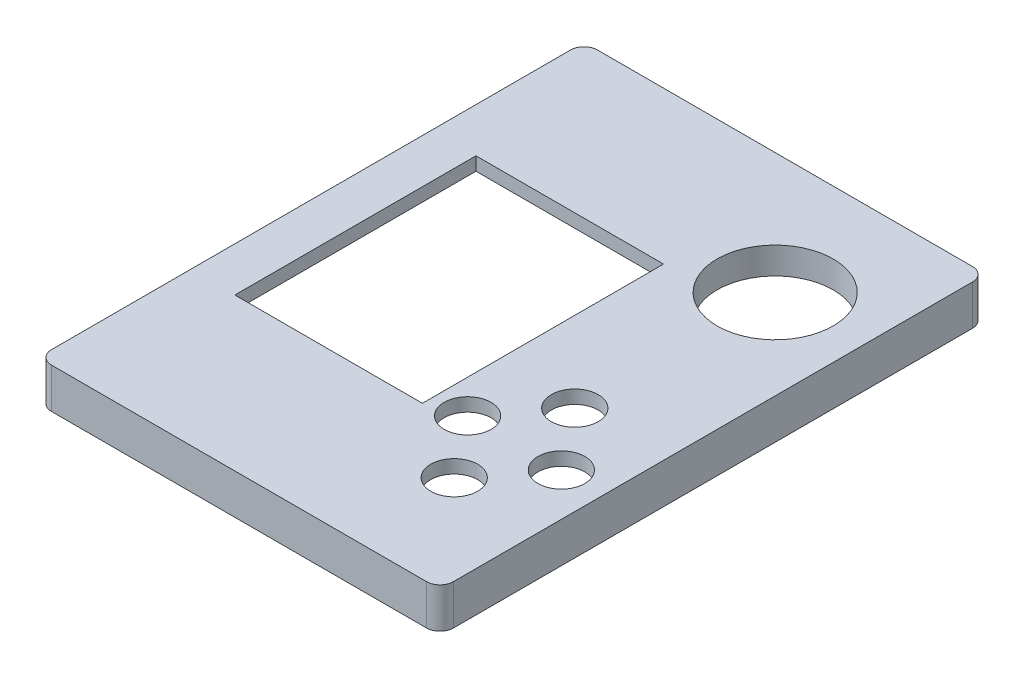
ISO-10303-21;
HEADER;
FILE_DESCRIPTION(('STEP AP214'),'2;1');
FILE_NAME('part.step','',(''),(''),'','','');
FILE_SCHEMA(('AUTOMOTIVE_DESIGN { 1 0 10303 214 1 1 1 1 }'));
ENDSEC;
DATA;
#1=APPLICATION_CONTEXT('core data for automotive mechanical design processes');
#2=APPLICATION_PROTOCOL_DEFINITION('international standard','automotive_design',2000,#1);
#3=PRODUCT_CONTEXT('',#1,'mechanical');
#4=PRODUCT('Part','Part','',(#3));
#5=PRODUCT_RELATED_PRODUCT_CATEGORY('part','',(#4));
#6=PRODUCT_DEFINITION_FORMATION('','',#4);
#7=PRODUCT_DEFINITION_CONTEXT('part definition',#1,'design');
#8=PRODUCT_DEFINITION('design','',#6,#7);
#9=PRODUCT_DEFINITION_SHAPE('','',#8);
#10=(LENGTH_UNIT() NAMED_UNIT(*) SI_UNIT(.MILLI.,.METRE.));
#11=(NAMED_UNIT(*) PLANE_ANGLE_UNIT() SI_UNIT($,.RADIAN.));
#12=(NAMED_UNIT(*) SI_UNIT($,.STERADIAN.) SOLID_ANGLE_UNIT());
#13=UNCERTAINTY_MEASURE_WITH_UNIT(LENGTH_MEASURE(1.E-05),#10,'distance_accuracy_value','');
#14=(GEOMETRIC_REPRESENTATION_CONTEXT(3) GLOBAL_UNCERTAINTY_ASSIGNED_CONTEXT((#13)) GLOBAL_UNIT_ASSIGNED_CONTEXT((#10,
#11,#12)) REPRESENTATION_CONTEXT('',''));
#15=CARTESIAN_POINT('',(0.,0.,0.));
#16=DIRECTION('',(0.,0.,1.));
#17=DIRECTION('',(1.,0.,0.));
#18=AXIS2_PLACEMENT_3D('',#15,#16,#17);
#19=CARTESIAN_POINT('',(-35.959,9.,37.875));
#20=DIRECTION('',(0.,-1.,0.));
#21=DIRECTION('',(0.,0.,-1.));
#22=AXIS2_PLACEMENT_3D('',#19,#20,#21);
#23=CYLINDRICAL_SURFACE('',#22,1.45);
#24=CARTESIAN_POINT('',(-35.959,0.,37.875));
#25=DIRECTION('',(0.,-1.,0.));
#26=DIRECTION('',(0.,0.,-1.));
#27=AXIS2_PLACEMENT_3D('',#24,#25,#26);
#28=CIRCLE('',#27,1.45);
#29=CARTESIAN_POINT('',(-35.959,0.,36.425));
#30=VERTEX_POINT('',#29);
#31=EDGE_CURVE('E286',#30,#30,#28,.T.);
#32=ORIENTED_EDGE('',*,*,#31,.T.);
#33=EDGE_LOOP('',(#32));
#34=FACE_BOUND('',#33,.T.);
#35=CARTESIAN_POINT('',(-35.959,7.,37.875));
#36=DIRECTION('',(0.,1.,0.));
#37=DIRECTION('',(0.,0.,1.));
#38=AXIS2_PLACEMENT_3D('',#35,#36,#37);
#39=CIRCLE('',#38,1.45);
#40=CARTESIAN_POINT('',(-35.959,7.,39.325));
#41=VERTEX_POINT('',#40);
#42=EDGE_CURVE('E12',#41,#41,#39,.F.);
#43=ORIENTED_EDGE('',*,*,#42,.F.);
#44=EDGE_LOOP('',(#43));
#45=FACE_BOUND('',#44,.T.);
#46=ADVANCED_FACE('F44',(#34,#45),#23,.F.);
#47=CARTESIAN_POINT('',(-35.959,9.,-52.125));
#48=DIRECTION('',(0.,-1.,0.));
#49=DIRECTION('',(0.,0.,-1.));
#50=AXIS2_PLACEMENT_3D('',#47,#48,#49);
#51=CYLINDRICAL_SURFACE('',#50,1.45);
#52=CARTESIAN_POINT('',(-35.959,0.,-52.125));
#53=DIRECTION('',(0.,-1.,0.));
#54=DIRECTION('',(0.,0.,-1.));
#55=AXIS2_PLACEMENT_3D('',#52,#53,#54);
#56=CIRCLE('',#55,1.45);
#57=CARTESIAN_POINT('',(-35.959,0.,-53.5749999999999));
#58=VERTEX_POINT('',#57);
#59=EDGE_CURVE('E287',#58,#58,#56,.T.);
#60=ORIENTED_EDGE('',*,*,#59,.T.);
#61=EDGE_LOOP('',(#60));
#62=FACE_BOUND('',#61,.T.);
#63=CARTESIAN_POINT('',(-35.959,7.,-52.125));
#64=DIRECTION('',(0.,1.,0.));
#65=DIRECTION('',(0.,0.,1.));
#66=AXIS2_PLACEMENT_3D('',#63,#64,#65);
#67=CIRCLE('',#66,1.45);
#68=CARTESIAN_POINT('',(-35.959,7.,-50.6749999999999));
#69=VERTEX_POINT('',#68);
#70=EDGE_CURVE('E52',#69,#69,#67,.F.);
#71=ORIENTED_EDGE('',*,*,#70,.F.);
#72=EDGE_LOOP('',(#71));
#73=FACE_BOUND('',#72,.T.);
#74=ADVANCED_FACE('F354',(#62,#73),#51,.F.);
#75=CARTESIAN_POINT('',(35.959,9.,37.875));
#76=DIRECTION('',(0.,-1.,0.));
#77=DIRECTION('',(0.,0.,-1.));
#78=AXIS2_PLACEMENT_3D('',#75,#76,#77);
#79=CYLINDRICAL_SURFACE('',#78,1.45);
#80=CARTESIAN_POINT('',(35.959,0.,37.875));
#81=DIRECTION('',(0.,1.,0.));
#82=DIRECTION('',(0.,0.,-1.));
#83=AXIS2_PLACEMENT_3D('',#80,#81,#82);
#84=CIRCLE('',#83,1.45);
#85=CARTESIAN_POINT('',(35.959,0.,36.425));
#86=VERTEX_POINT('',#85);
#87=EDGE_CURVE('E228',#86,#86,#84,.T.);
#88=ORIENTED_EDGE('',*,*,#87,.F.);
#89=EDGE_LOOP('',(#88));
#90=FACE_BOUND('',#89,.T.);
#91=CARTESIAN_POINT('',(35.959,7.,37.875));
#92=DIRECTION('',(0.,1.,0.));
#93=DIRECTION('',(0.,0.,1.));
#94=AXIS2_PLACEMENT_3D('',#91,#92,#93);
#95=CIRCLE('',#94,1.45);
#96=CARTESIAN_POINT('',(35.959,7.,39.325));
#97=VERTEX_POINT('',#96);
#98=EDGE_CURVE('E545',#97,#97,#95,.T.);
#99=ORIENTED_EDGE('',*,*,#98,.T.);
#100=EDGE_LOOP('',(#99));
#101=FACE_BOUND('',#100,.T.);
#102=ADVANCED_FACE('F356',(#90,#101),#79,.F.);
#103=CARTESIAN_POINT('',(35.959,9.,-52.125));
#104=DIRECTION('',(0.,-1.,0.));
#105=DIRECTION('',(0.,0.,-1.));
#106=AXIS2_PLACEMENT_3D('',#103,#104,#105);
#107=CYLINDRICAL_SURFACE('',#106,1.45);
#108=CARTESIAN_POINT('',(35.959,0.,-52.125));
#109=DIRECTION('',(0.,1.,0.));
#110=DIRECTION('',(0.,0.,-1.));
#111=AXIS2_PLACEMENT_3D('',#108,#109,#110);
#112=CIRCLE('',#111,1.45);
#113=CARTESIAN_POINT('',(35.959,0.,-53.5749999999999));
#114=VERTEX_POINT('',#113);
#115=EDGE_CURVE('E278',#114,#114,#112,.T.);
#116=ORIENTED_EDGE('',*,*,#115,.F.);
#117=EDGE_LOOP('',(#116));
#118=FACE_BOUND('',#117,.T.);
#119=CARTESIAN_POINT('',(35.959,7.,-52.125));
#120=DIRECTION('',(0.,1.,0.));
#121=DIRECTION('',(0.,0.,1.));
#122=AXIS2_PLACEMENT_3D('',#119,#120,#121);
#123=CIRCLE('',#122,1.45);
#124=CARTESIAN_POINT('',(35.959,7.,-50.6749999999999));
#125=VERTEX_POINT('',#124);
#126=EDGE_CURVE('E543',#125,#125,#123,.T.);
#127=ORIENTED_EDGE('',*,*,#126,.T.);
#128=EDGE_LOOP('',(#127));
#129=FACE_BOUND('',#128,.T.);
#130=ADVANCED_FACE('F363',(#118,#129),#107,.F.);
#131=CARTESIAN_POINT('',(24.9344177008975,-0.000999999999999265,-34.));
#132=DIRECTION('',(0.,1.,0.));
#133=DIRECTION('',(0.,0.,1.));
#134=AXIS2_PLACEMENT_3D('',#131,#132,#133);
#135=CYLINDRICAL_SURFACE('',#134,13.);
#136=CARTESIAN_POINT('',(24.9344177008975,9.,-34.));
#137=DIRECTION('',(0.,1.,0.));
#138=DIRECTION('',(0.,0.,1.));
#139=AXIS2_PLACEMENT_3D('',#136,#137,#138);
#140=CIRCLE('',#139,13.);
#141=CARTESIAN_POINT('',(24.9344177008975,9.,-21.));
#142=VERTEX_POINT('',#141);
#143=EDGE_CURVE('E281',#142,#142,#140,.T.);
#144=ORIENTED_EDGE('',*,*,#143,.T.);
#145=EDGE_LOOP('',(#144));
#146=FACE_BOUND('',#145,.T.);
#147=CARTESIAN_POINT('',(24.9344177008975,3.,-34.));
#148=DIRECTION('',(0.,-1.,0.));
#149=DIRECTION('',(0.,0.,-1.));
#150=AXIS2_PLACEMENT_3D('',#147,#148,#149);
#151=CIRCLE('',#150,13.);
#152=CARTESIAN_POINT('',(24.9344177008975,3.,-47.));
#153=VERTEX_POINT('',#152);
#154=EDGE_CURVE('E213',#153,#153,#151,.F.);
#155=ORIENTED_EDGE('',*,*,#154,.F.);
#156=EDGE_LOOP('',(#155));
#157=FACE_BOUND('',#156,.T.);
#158=ADVANCED_FACE('F369',(#146,#157),#135,.F.);
#159=CARTESIAN_POINT('',(24.9344177008975,-0.000999999999999265,-34.));
#160=DIRECTION('',(0.,1.,0.));
#161=DIRECTION('',(0.,0.,1.));
#162=AXIS2_PLACEMENT_3D('',#159,#160,#161);
#163=CYLINDRICAL_SURFACE('',#162,16.);
#164=CARTESIAN_POINT('',(24.9344177008975,6.,-34.));
#165=DIRECTION('',(0.,1.,0.));
#166=DIRECTION('',(0.,0.,1.));
#167=AXIS2_PLACEMENT_3D('',#164,#165,#166);
#168=CIRCLE('',#167,16.);
#169=CARTESIAN_POINT('',(24.9344177008975,6.,-18.));
#170=VERTEX_POINT('',#169);
#171=EDGE_CURVE('E244',#170,#170,#168,.T.);
#172=ORIENTED_EDGE('',*,*,#171,.F.);
#173=EDGE_LOOP('',(#172));
#174=FACE_BOUND('',#173,.T.);
#175=CARTESIAN_POINT('',(24.9344177008975,3.,-34.));
#176=DIRECTION('',(0.,-1.,0.));
#177=DIRECTION('',(0.,0.,-1.));
#178=AXIS2_PLACEMENT_3D('',#175,#176,#177);
#179=CIRCLE('',#178,16.);
#180=CARTESIAN_POINT('',(24.9344177008975,3.,-50.));
#181=VERTEX_POINT('',#180);
#182=EDGE_CURVE('E208',#181,#181,#179,.T.);
#183=ORIENTED_EDGE('',*,*,#182,.F.);
#184=EDGE_LOOP('',(#183));
#185=FACE_BOUND('',#184,.T.);
#186=ADVANCED_FACE('F523',(#174,#185),#163,.T.);
#187=CARTESIAN_POINT('',(42.,0.,58.125));
#188=DIRECTION('',(0.,1.,0.));
#189=DIRECTION('',(0.,0.,1.));
#190=AXIS2_PLACEMENT_3D('',#187,#188,#189);
#191=PLANE('',#190);
#192=ORIENTED_EDGE('',*,*,#115,.T.);
#193=EDGE_LOOP('',(#192));
#194=FACE_BOUND('',#193,.T.);
#195=CARTESIAN_POINT('',(35.959,0.,-52.125));
#196=DIRECTION('',(0.,1.,0.));
#197=DIRECTION('',(0.,0.,1.));
#198=AXIS2_PLACEMENT_3D('',#195,#196,#197);
#199=CIRCLE('',#198,4.45);
#200=CARTESIAN_POINT('',(35.959,0.,-47.6749999999999));
#201=VERTEX_POINT('',#200);
#202=EDGE_CURVE('E245',#201,#201,#199,.T.);
#203=ORIENTED_EDGE('',*,*,#202,.F.);
#204=EDGE_LOOP('',(#203));
#205=FACE_BOUND('',#204,.T.);
#206=ADVANCED_FACE('F381',(#194,#205),#191,.F.);
#207=ORIENTED_EDGE('',*,*,#87,.T.);
#208=EDGE_LOOP('',(#207));
#209=FACE_BOUND('',#208,.T.);
#210=CARTESIAN_POINT('',(35.959,0.,37.875));
#211=DIRECTION('',(0.,1.,0.));
#212=DIRECTION('',(0.,0.,1.));
#213=AXIS2_PLACEMENT_3D('',#210,#211,#212);
#214=CIRCLE('',#213,4.45);
#215=CARTESIAN_POINT('',(35.959,0.,42.3250000000001));
#216=VERTEX_POINT('',#215);
#217=EDGE_CURVE('E216',#216,#216,#214,.T.);
#218=ORIENTED_EDGE('',*,*,#217,.F.);
#219=EDGE_LOOP('',(#218));
#220=FACE_BOUND('',#219,.T.);
#221=ADVANCED_FACE('F444',(#209,#220),#191,.F.);
#222=CARTESIAN_POINT('',(-35.959,0.,-52.125));
#223=DIRECTION('',(0.,1.,0.));
#224=DIRECTION('',(0.,0.,1.));
#225=AXIS2_PLACEMENT_3D('',#222,#223,#224);
#226=CIRCLE('',#225,4.45);
#227=CARTESIAN_POINT('',(-35.959,0.,-47.6749999999999));
#228=VERTEX_POINT('',#227);
#229=EDGE_CURVE('E256',#228,#228,#226,.F.);
#230=ORIENTED_EDGE('',*,*,#229,.T.);
#231=EDGE_LOOP('',(#230));
#232=FACE_BOUND('',#231,.T.);
#233=ORIENTED_EDGE('',*,*,#59,.F.);
#234=EDGE_LOOP('',(#233));
#235=FACE_BOUND('',#234,.T.);
#236=ADVANCED_FACE('F439',(#232,#235),#191,.F.);
#237=CARTESIAN_POINT('',(-35.959,0.,37.875));
#238=DIRECTION('',(0.,1.,0.));
#239=DIRECTION('',(0.,0.,1.));
#240=AXIS2_PLACEMENT_3D('',#237,#238,#239);
#241=CIRCLE('',#240,4.45);
#242=CARTESIAN_POINT('',(-35.959,0.,42.3250000000001));
#243=VERTEX_POINT('',#242);
#244=EDGE_CURVE('E259',#243,#243,#241,.F.);
#245=ORIENTED_EDGE('',*,*,#244,.T.);
#246=EDGE_LOOP('',(#245));
#247=FACE_BOUND('',#246,.T.);
#248=ORIENTED_EDGE('',*,*,#31,.F.);
#249=EDGE_LOOP('',(#248));
#250=FACE_BOUND('',#249,.T.);
#251=ADVANCED_FACE('F382',(#247,#250),#191,.F.);
#252=CARTESIAN_POINT('',(42.,9.,58.125));
#253=DIRECTION('',(0.,-1.,0.));
#254=DIRECTION('',(0.,0.,-1.));
#255=AXIS2_PLACEMENT_3D('',#252,#253,#254);
#256=CYLINDRICAL_SURFACE('',#255,3.00000000000001);
#257=CARTESIAN_POINT('',(42.,0.,58.125));
#258=DIRECTION('',(0.,1.,0.));
#259=DIRECTION('',(0.,0.,1.));
#260=AXIS2_PLACEMENT_3D('',#257,#258,#259);
#261=CIRCLE('',#260,3.00000000000001);
#262=CARTESIAN_POINT('',(42.,0.,61.125));
#263=VERTEX_POINT('',#262);
#264=CARTESIAN_POINT('',(45.,0.,58.125));
#265=VERTEX_POINT('',#264);
#266=EDGE_CURVE('E290',#263,#265,#261,.T.);
#267=ORIENTED_EDGE('',*,*,#266,.T.);
#268=DIRECTION('',(0.,-1.,0.));
#269=VECTOR('',#268,1.);
#270=CARTESIAN_POINT('',(45.,9.,58.125));
#271=LINE('',#270,#269);
#272=CARTESIAN_POINT('',(45.,9.,58.125));
#273=VERTEX_POINT('',#272);
#274=EDGE_CURVE('E347',#273,#265,#271,.T.);
#275=ORIENTED_EDGE('',*,*,#274,.F.);
#276=CARTESIAN_POINT('',(42.,9.,58.125));
#277=DIRECTION('',(0.,1.,0.));
#278=DIRECTION('',(0.,0.,1.));
#279=AXIS2_PLACEMENT_3D('',#276,#277,#278);
#280=CIRCLE('',#279,3.00000000000001);
#281=CARTESIAN_POINT('',(42.,9.,61.125));
#282=VERTEX_POINT('',#281);
#283=EDGE_CURVE('E293',#282,#273,#280,.T.);
#284=ORIENTED_EDGE('',*,*,#283,.F.);
#285=DIRECTION('',(0.,-1.,0.));
#286=VECTOR('',#285,1.);
#287=CARTESIAN_POINT('',(42.,9.,61.125));
#288=LINE('',#287,#286);
#289=EDGE_CURVE('E311',#282,#263,#288,.T.);
#290=ORIENTED_EDGE('',*,*,#289,.T.);
#291=EDGE_LOOP('',(#267,#275,#284,#290));
#292=FACE_BOUND('',#291,.T.);
#293=ADVANCED_FACE('F46',(#292),#256,.T.);
#294=CARTESIAN_POINT('',(45.,9.,58.125));
#295=DIRECTION('',(-1.,0.,0.));
#296=DIRECTION('',(0.,0.,1.));
#297=AXIS2_PLACEMENT_3D('',#294,#295,#296);
#298=PLANE('',#297);
#299=DIRECTION('',(0.,0.,-1.));
#300=VECTOR('',#299,1.);
#301=CARTESIAN_POINT('',(45.,0.,58.125));
#302=LINE('',#301,#300);
#303=CARTESIAN_POINT('',(45.,0.,-58.125));
#304=VERTEX_POINT('',#303);
#305=EDGE_CURVE('E314',#265,#304,#302,.T.);
#306=ORIENTED_EDGE('',*,*,#305,.T.);
#307=DIRECTION('',(0.,-1.,0.));
#308=VECTOR('',#307,1.);
#309=CARTESIAN_POINT('',(45.,9.,-58.125));
#310=LINE('',#309,#308);
#311=CARTESIAN_POINT('',(45.,9.,-58.125));
#312=VERTEX_POINT('',#311);
#313=EDGE_CURVE('E344',#312,#304,#310,.T.);
#314=ORIENTED_EDGE('',*,*,#313,.F.);
#315=DIRECTION('',(0.,0.,-1.));
#316=VECTOR('',#315,1.);
#317=CARTESIAN_POINT('',(45.,9.,58.125));
#318=LINE('',#317,#316);
#319=EDGE_CURVE('E296',#273,#312,#318,.T.);
#320=ORIENTED_EDGE('',*,*,#319,.F.);
#321=ORIENTED_EDGE('',*,*,#274,.T.);
#322=EDGE_LOOP('',(#306,#314,#320,#321));
#323=FACE_BOUND('',#322,.T.);
#324=ADVANCED_FACE('F404',(#323),#298,.F.);
#325=CARTESIAN_POINT('',(42.,9.,-58.125));
#326=DIRECTION('',(0.,-1.,0.));
#327=DIRECTION('',(0.,0.,-1.));
#328=AXIS2_PLACEMENT_3D('',#325,#326,#327);
#329=CYLINDRICAL_SURFACE('',#328,3.);
#330=CARTESIAN_POINT('',(42.,0.,-58.125));
#331=DIRECTION('',(0.,1.,0.));
#332=DIRECTION('',(0.,0.,-1.));
#333=AXIS2_PLACEMENT_3D('',#330,#331,#332);
#334=CIRCLE('',#333,3.);
#335=CARTESIAN_POINT('',(42.,0.,-61.125));
#336=VERTEX_POINT('',#335);
#337=EDGE_CURVE('E316',#304,#336,#334,.T.);
#338=ORIENTED_EDGE('',*,*,#337,.T.);
#339=DIRECTION('',(0.,-1.,0.));
#340=VECTOR('',#339,1.);
#341=CARTESIAN_POINT('',(42.,9.,-61.125));
#342=LINE('',#341,#340);
#343=CARTESIAN_POINT('',(42.,9.,-61.125));
#344=VERTEX_POINT('',#343);
#345=EDGE_CURVE('E341',#344,#336,#342,.T.);
#346=ORIENTED_EDGE('',*,*,#345,.F.);
#347=CARTESIAN_POINT('',(42.,9.,-58.125));
#348=DIRECTION('',(0.,1.,0.));
#349=DIRECTION('',(0.,0.,-1.));
#350=AXIS2_PLACEMENT_3D('',#347,#348,#349);
#351=CIRCLE('',#350,3.);
#352=EDGE_CURVE('E299',#312,#344,#351,.T.);
#353=ORIENTED_EDGE('',*,*,#352,.F.);
#354=ORIENTED_EDGE('',*,*,#313,.T.);
#355=EDGE_LOOP('',(#338,#346,#353,#354));
#356=FACE_BOUND('',#355,.T.);
#357=ADVANCED_FACE('F401',(#356),#329,.T.);
#358=CARTESIAN_POINT('',(-42.,9.,-61.125));
#359=DIRECTION('',(0.,0.,1.));
#360=DIRECTION('',(1.,0.,0.));
#361=AXIS2_PLACEMENT_3D('',#358,#359,#360);
#362=PLANE('',#361);
#363=DIRECTION('',(-1.,0.,0.));
#364=VECTOR('',#363,1.);
#365=CARTESIAN_POINT('',(-42.,0.,-61.125));
#366=LINE('',#365,#364);
#367=CARTESIAN_POINT('',(-42.,0.,-61.125));
#368=VERTEX_POINT('',#367);
#369=EDGE_CURVE('E318',#336,#368,#366,.T.);
#370=ORIENTED_EDGE('',*,*,#369,.T.);
#371=DIRECTION('',(0.,-1.,0.));
#372=VECTOR('',#371,1.);
#373=CARTESIAN_POINT('',(-42.,9.,-61.125));
#374=LINE('',#373,#372);
#375=CARTESIAN_POINT('',(-42.,9.,-61.125));
#376=VERTEX_POINT('',#375);
#377=EDGE_CURVE('E338',#376,#368,#374,.T.);
#378=ORIENTED_EDGE('',*,*,#377,.F.);
#379=DIRECTION('',(-1.,0.,0.));
#380=VECTOR('',#379,1.);
#381=CARTESIAN_POINT('',(-42.,9.,-61.125));
#382=LINE('',#381,#380);
#383=EDGE_CURVE('E301',#344,#376,#382,.T.);
#384=ORIENTED_EDGE('',*,*,#383,.F.);
#385=ORIENTED_EDGE('',*,*,#345,.T.);
#386=EDGE_LOOP('',(#370,#378,#384,#385));
#387=FACE_BOUND('',#386,.T.);
#388=ADVANCED_FACE('F397',(#387),#362,.F.);
#389=CARTESIAN_POINT('',(-42.,9.,-58.125));
#390=DIRECTION('',(0.,-1.,0.));
#391=DIRECTION('',(0.,0.,-1.));
#392=AXIS2_PLACEMENT_3D('',#389,#390,#391);
#393=CYLINDRICAL_SURFACE('',#392,3.);
#394=CARTESIAN_POINT('',(-42.,0.,-58.125));
#395=DIRECTION('',(0.,1.,0.));
#396=DIRECTION('',(0.,0.,-1.));
#397=AXIS2_PLACEMENT_3D('',#394,#395,#396);
#398=CIRCLE('',#397,3.);
#399=CARTESIAN_POINT('',(-45.,0.,-58.125));
#400=VERTEX_POINT('',#399);
#401=EDGE_CURVE('E320',#368,#400,#398,.T.);
#402=ORIENTED_EDGE('',*,*,#401,.T.);
#403=DIRECTION('',(0.,-1.,0.));
#404=VECTOR('',#403,1.);
#405=CARTESIAN_POINT('',(-45.,9.,-58.125));
#406=LINE('',#405,#404);
#407=CARTESIAN_POINT('',(-45.,9.,-58.125));
#408=VERTEX_POINT('',#407);
#409=EDGE_CURVE('E335',#408,#400,#406,.T.);
#410=ORIENTED_EDGE('',*,*,#409,.F.);
#411=CARTESIAN_POINT('',(-42.,9.,-58.125));
#412=DIRECTION('',(0.,1.,0.));
#413=DIRECTION('',(0.,0.,-1.));
#414=AXIS2_PLACEMENT_3D('',#411,#412,#413);
#415=CIRCLE('',#414,3.);
#416=EDGE_CURVE('E303',#376,#408,#415,.T.);
#417=ORIENTED_EDGE('',*,*,#416,.F.);
#418=ORIENTED_EDGE('',*,*,#377,.T.);
#419=EDGE_LOOP('',(#402,#410,#417,#418));
#420=FACE_BOUND('',#419,.T.);
#421=ADVANCED_FACE('F393',(#420),#393,.T.);
#422=CARTESIAN_POINT('',(-45.,9.,58.125));
#423=DIRECTION('',(1.,0.,0.));
#424=DIRECTION('',(0.,0.,-1.));
#425=AXIS2_PLACEMENT_3D('',#422,#423,#424);
#426=PLANE('',#425);
#427=DIRECTION('',(0.,0.,1.));
#428=VECTOR('',#427,1.);
#429=CARTESIAN_POINT('',(-45.,0.,58.125));
#430=LINE('',#429,#428);
#431=CARTESIAN_POINT('',(-45.,0.,58.125));
#432=VERTEX_POINT('',#431);
#433=EDGE_CURVE('E322',#400,#432,#430,.T.);
#434=ORIENTED_EDGE('',*,*,#433,.T.);
#435=DIRECTION('',(0.,-1.,0.));
#436=VECTOR('',#435,1.);
#437=CARTESIAN_POINT('',(-45.,9.,58.125));
#438=LINE('',#437,#436);
#439=CARTESIAN_POINT('',(-45.,9.,58.125));
#440=VERTEX_POINT('',#439);
#441=EDGE_CURVE('E332',#440,#432,#438,.T.);
#442=ORIENTED_EDGE('',*,*,#441,.F.);
#443=DIRECTION('',(0.,0.,1.));
#444=VECTOR('',#443,1.);
#445=CARTESIAN_POINT('',(-45.,9.,58.125));
#446=LINE('',#445,#444);
#447=EDGE_CURVE('E305',#408,#440,#446,.T.);
#448=ORIENTED_EDGE('',*,*,#447,.F.);
#449=ORIENTED_EDGE('',*,*,#409,.T.);
#450=EDGE_LOOP('',(#434,#442,#448,#449));
#451=FACE_BOUND('',#450,.T.);
#452=ADVANCED_FACE('F389',(#451),#426,.F.);
#453=CARTESIAN_POINT('',(-42.,9.,58.125));
#454=DIRECTION('',(0.,-1.,0.));
#455=DIRECTION('',(0.,0.,-1.));
#456=AXIS2_PLACEMENT_3D('',#453,#454,#455);
#457=CYLINDRICAL_SURFACE('',#456,3.00000000000001);
#458=CARTESIAN_POINT('',(-42.,0.,58.125));
#459=DIRECTION('',(0.,1.,0.));
#460=DIRECTION('',(0.,0.,-1.));
#461=AXIS2_PLACEMENT_3D('',#458,#459,#460);
#462=CIRCLE('',#461,3.00000000000001);
#463=CARTESIAN_POINT('',(-42.,0.,61.125));
#464=VERTEX_POINT('',#463);
#465=EDGE_CURVE('E324',#432,#464,#462,.T.);
#466=ORIENTED_EDGE('',*,*,#465,.T.);
#467=DIRECTION('',(0.,-1.,0.));
#468=VECTOR('',#467,1.);
#469=CARTESIAN_POINT('',(-42.,9.,61.125));
#470=LINE('',#469,#468);
#471=CARTESIAN_POINT('',(-42.,9.,61.125));
#472=VERTEX_POINT('',#471);
#473=EDGE_CURVE('E329',#472,#464,#470,.T.);
#474=ORIENTED_EDGE('',*,*,#473,.F.);
#475=CARTESIAN_POINT('',(-42.,9.,58.125));
#476=DIRECTION('',(0.,1.,0.));
#477=DIRECTION('',(0.,0.,-1.));
#478=AXIS2_PLACEMENT_3D('',#475,#476,#477);
#479=CIRCLE('',#478,3.00000000000001);
#480=EDGE_CURVE('E307',#440,#472,#479,.T.);
#481=ORIENTED_EDGE('',*,*,#480,.F.);
#482=ORIENTED_EDGE('',*,*,#441,.T.);
#483=EDGE_LOOP('',(#466,#474,#481,#482));
#484=FACE_BOUND('',#483,.T.);
#485=ADVANCED_FACE('F385',(#484),#457,.T.);
#486=CARTESIAN_POINT('',(-42.,9.,61.125));
#487=DIRECTION('',(0.,0.,-1.));
#488=DIRECTION('',(-1.,0.,0.));
#489=AXIS2_PLACEMENT_3D('',#486,#487,#488);
#490=PLANE('',#489);
#491=DIRECTION('',(1.,0.,0.));
#492=VECTOR('',#491,1.);
#493=CARTESIAN_POINT('',(-42.,0.,61.125));
#494=LINE('',#493,#492);
#495=EDGE_CURVE('E297',#464,#263,#494,.T.);
#496=ORIENTED_EDGE('',*,*,#495,.T.);
#497=ORIENTED_EDGE('',*,*,#289,.F.);
#498=DIRECTION('',(1.,0.,0.));
#499=VECTOR('',#498,1.);
#500=CARTESIAN_POINT('',(-42.,9.,61.125));
#501=LINE('',#500,#499);
#502=EDGE_CURVE('E309',#472,#282,#501,.T.);
#503=ORIENTED_EDGE('',*,*,#502,.F.);
#504=ORIENTED_EDGE('',*,*,#473,.T.);
#505=EDGE_LOOP('',(#496,#497,#503,#504));
#506=FACE_BOUND('',#505,.T.);
#507=ADVANCED_FACE('F375',(#506),#490,.F.);
#508=CARTESIAN_POINT('',(42.,9.,58.125));
#509=DIRECTION('',(0.,1.,0.));
#510=DIRECTION('',(0.,0.,1.));
#511=AXIS2_PLACEMENT_3D('',#508,#509,#510);
#512=PLANE('',#511);
#513=CARTESIAN_POINT('',(14.4344177008975,9.,24.375));
#514=DIRECTION('',(0.,1.,0.));
#515=DIRECTION('',(0.,0.,1.));
#516=AXIS2_PLACEMENT_3D('',#513,#514,#515);
#517=CIRCLE('',#516,5.25);
#518=CARTESIAN_POINT('',(14.4344177008975,9.,29.625));
#519=VERTEX_POINT('',#518);
#520=EDGE_CURVE('E191',#519,#519,#517,.F.);
#521=ORIENTED_EDGE('',*,*,#520,.T.);
#522=EDGE_LOOP('',(#521));
#523=FACE_BOUND('',#522,.T.);
#524=CARTESIAN_POINT('',(24.9344177008975,9.,10.875));
#525=DIRECTION('',(0.,1.,0.));
#526=DIRECTION('',(0.,0.,1.));
#527=AXIS2_PLACEMENT_3D('',#524,#525,#526);
#528=CIRCLE('',#527,5.25);
#529=CARTESIAN_POINT('',(24.9344177008975,9.,16.125));
#530=VERTEX_POINT('',#529);
#531=EDGE_CURVE('E198',#530,#530,#528,.F.);
#532=ORIENTED_EDGE('',*,*,#531,.T.);
#533=EDGE_LOOP('',(#532));
#534=FACE_BOUND('',#533,.T.);
#535=CARTESIAN_POINT('',(24.9344177008975,9.,37.875));
#536=DIRECTION('',(0.,1.,0.));
#537=DIRECTION('',(0.,0.,1.));
#538=AXIS2_PLACEMENT_3D('',#535,#536,#537);
#539=CIRCLE('',#538,5.25);
#540=CARTESIAN_POINT('',(24.9344177008975,9.,43.125));
#541=VERTEX_POINT('',#540);
#542=EDGE_CURVE('E204',#541,#541,#539,.F.);
#543=ORIENTED_EDGE('',*,*,#542,.T.);
#544=EDGE_LOOP('',(#543));
#545=FACE_BOUND('',#544,.T.);
#546=DIRECTION('',(0.,0.,1.));
#547=VECTOR('',#546,1.);
#548=CARTESIAN_POINT('',(6.93441770089745,9.,27.));
#549=LINE('',#548,#547);
#550=CARTESIAN_POINT('',(6.93441770089746,9.,-27.));
#551=VERTEX_POINT('',#550);
#552=CARTESIAN_POINT('',(6.93441770089745,9.,27.));
#553=VERTEX_POINT('',#552);
#554=EDGE_CURVE('E160',#551,#553,#549,.T.);
#555=ORIENTED_EDGE('',*,*,#554,.T.);
#556=DIRECTION('',(-1.,0.,0.));
#557=VECTOR('',#556,1.);
#558=CARTESIAN_POINT('',(-35.0655822991026,9.,27.));
#559=LINE('',#558,#557);
#560=CARTESIAN_POINT('',(-35.0655822991026,9.,27.));
#561=VERTEX_POINT('',#560);
#562=EDGE_CURVE('E164',#553,#561,#559,.T.);
#563=ORIENTED_EDGE('',*,*,#562,.T.);
#564=DIRECTION('',(0.,0.,-1.));
#565=VECTOR('',#564,1.);
#566=CARTESIAN_POINT('',(-35.0655822991026,9.,27.));
#567=LINE('',#566,#565);
#568=CARTESIAN_POINT('',(-35.0655822991025,9.,-27.));
#569=VERTEX_POINT('',#568);
#570=EDGE_CURVE('E187',#561,#569,#567,.T.);
#571=ORIENTED_EDGE('',*,*,#570,.T.);
#572=DIRECTION('',(1.,0.,0.));
#573=VECTOR('',#572,1.);
#574=CARTESIAN_POINT('',(-35.0655822991025,9.,-27.));
#575=LINE('',#574,#573);
#576=EDGE_CURVE('E181',#569,#551,#575,.T.);
#577=ORIENTED_EDGE('',*,*,#576,.T.);
#578=EDGE_LOOP('',(#555,#563,#571,#577));
#579=FACE_BOUND('',#578,.T.);
#580=CARTESIAN_POINT('',(35.4344177008975,9.,24.375));
#581=DIRECTION('',(0.,1.,0.));
#582=DIRECTION('',(0.,0.,1.));
#583=AXIS2_PLACEMENT_3D('',#580,#581,#582);
#584=CIRCLE('',#583,5.25);
#585=CARTESIAN_POINT('',(35.4344177008975,9.,29.625));
#586=VERTEX_POINT('',#585);
#587=EDGE_CURVE('E194',#586,#586,#584,.F.);
#588=ORIENTED_EDGE('',*,*,#587,.T.);
#589=EDGE_LOOP('',(#588));
#590=FACE_BOUND('',#589,.T.);
#591=ORIENTED_EDGE('',*,*,#143,.F.);
#592=EDGE_LOOP('',(#591));
#593=FACE_BOUND('',#592,.T.);
#594=ORIENTED_EDGE('',*,*,#283,.T.);
#595=ORIENTED_EDGE('',*,*,#319,.T.);
#596=ORIENTED_EDGE('',*,*,#352,.T.);
#597=ORIENTED_EDGE('',*,*,#383,.T.);
#598=ORIENTED_EDGE('',*,*,#416,.T.);
#599=ORIENTED_EDGE('',*,*,#447,.T.);
#600=ORIENTED_EDGE('',*,*,#480,.T.);
#601=ORIENTED_EDGE('',*,*,#502,.T.);
#602=EDGE_LOOP('',(#594,#595,#596,#597,#598,#599,#600,#601));
#603=FACE_BOUND('',#602,.T.);
#604=ADVANCED_FACE('F371',(#523,#534,#545,#579,#590,#593,#603),#512,.T.);
#605=DIRECTION('',(1.,0.,0.));
#606=VECTOR('',#605,1.);
#607=CARTESIAN_POINT('',(-42.,0.,58.125));
#608=LINE('',#607,#606);
#609=CARTESIAN_POINT('',(-42.,0.,58.125));
#610=VERTEX_POINT('',#609);
#611=CARTESIAN_POINT('',(42.,0.,58.125));
#612=VERTEX_POINT('',#611);
#613=EDGE_CURVE('E226',#610,#612,#608,.T.);
#614=ORIENTED_EDGE('',*,*,#613,.T.);
#615=DIRECTION('',(0.,0.,-1.));
#616=VECTOR('',#615,1.);
#617=CARTESIAN_POINT('',(42.,0.,58.125));
#618=LINE('',#617,#616);
#619=CARTESIAN_POINT('',(42.,0.,-58.125));
#620=VERTEX_POINT('',#619);
#621=EDGE_CURVE('E255',#612,#620,#618,.T.);
#622=ORIENTED_EDGE('',*,*,#621,.T.);
#623=DIRECTION('',(-1.,0.,0.));
#624=VECTOR('',#623,1.);
#625=CARTESIAN_POINT('',(-42.,0.,-58.125));
#626=LINE('',#625,#624);
#627=CARTESIAN_POINT('',(-42.,0.,-58.125));
#628=VERTEX_POINT('',#627);
#629=EDGE_CURVE('E262',#620,#628,#626,.T.);
#630=ORIENTED_EDGE('',*,*,#629,.T.);
#631=DIRECTION('',(0.,0.,1.));
#632=VECTOR('',#631,1.);
#633=CARTESIAN_POINT('',(-42.,0.,58.125));
#634=LINE('',#633,#632);
#635=EDGE_CURVE('E265',#628,#610,#634,.T.);
#636=ORIENTED_EDGE('',*,*,#635,.T.);
#637=EDGE_LOOP('',(#614,#622,#630,#636));
#638=FACE_BOUND('',#637,.T.);
#639=ORIENTED_EDGE('',*,*,#266,.F.);
#640=ORIENTED_EDGE('',*,*,#495,.F.);
#641=ORIENTED_EDGE('',*,*,#465,.F.);
#642=ORIENTED_EDGE('',*,*,#433,.F.);
#643=ORIENTED_EDGE('',*,*,#401,.F.);
#644=ORIENTED_EDGE('',*,*,#369,.F.);
#645=ORIENTED_EDGE('',*,*,#337,.F.);
#646=ORIENTED_EDGE('',*,*,#305,.F.);
#647=EDGE_LOOP('',(#639,#640,#641,#642,#643,#644,#645,#646));
#648=FACE_BOUND('',#647,.T.);
#649=ADVANCED_FACE('F374',(#638,#648),#191,.F.);
#650=CARTESIAN_POINT('',(42.,9.,58.125));
#651=DIRECTION('',(-1.,0.,0.));
#652=DIRECTION('',(0.,0.,1.));
#653=AXIS2_PLACEMENT_3D('',#650,#651,#652);
#654=PLANE('',#653);
#655=ORIENTED_EDGE('',*,*,#621,.F.);
#656=DIRECTION('',(0.,-1.,0.));
#657=VECTOR('',#656,1.);
#658=CARTESIAN_POINT('',(42.,9.,58.125));
#659=LINE('',#658,#657);
#660=CARTESIAN_POINT('',(42.,6.,58.125));
#661=VERTEX_POINT('',#660);
#662=EDGE_CURVE('E220',#661,#612,#659,.T.);
#663=ORIENTED_EDGE('',*,*,#662,.F.);
#664=DIRECTION('',(0.,0.,-1.));
#665=VECTOR('',#664,1.);
#666=CARTESIAN_POINT('',(42.,6.,58.125));
#667=LINE('',#666,#665);
#668=CARTESIAN_POINT('',(42.,6.,-58.125));
#669=VERTEX_POINT('',#668);
#670=EDGE_CURVE('E222',#661,#669,#667,.T.);
#671=ORIENTED_EDGE('',*,*,#670,.T.);
#672=DIRECTION('',(0.,-1.,0.));
#673=VECTOR('',#672,1.);
#674=CARTESIAN_POINT('',(42.,9.,-58.125));
#675=LINE('',#674,#673);
#676=EDGE_CURVE('E217',#669,#620,#675,.T.);
#677=ORIENTED_EDGE('',*,*,#676,.T.);
#678=EDGE_LOOP('',(#655,#663,#671,#677));
#679=FACE_BOUND('',#678,.T.);
#680=ADVANCED_FACE('F379',(#679),#654,.T.);
#681=CARTESIAN_POINT('',(-42.,9.,-58.125));
#682=DIRECTION('',(0.,0.,1.));
#683=DIRECTION('',(1.,0.,0.));
#684=AXIS2_PLACEMENT_3D('',#681,#682,#683);
#685=PLANE('',#684);
#686=ORIENTED_EDGE('',*,*,#629,.F.);
#687=ORIENTED_EDGE('',*,*,#676,.F.);
#688=DIRECTION('',(-1.,0.,0.));
#689=VECTOR('',#688,1.);
#690=CARTESIAN_POINT('',(-42.,6.,-58.125));
#691=LINE('',#690,#689);
#692=CARTESIAN_POINT('',(-42.,6.,-58.125));
#693=VERTEX_POINT('',#692);
#694=EDGE_CURVE('E225',#669,#693,#691,.T.);
#695=ORIENTED_EDGE('',*,*,#694,.T.);
#696=DIRECTION('',(0.,-1.,0.));
#697=VECTOR('',#696,1.);
#698=CARTESIAN_POINT('',(-42.,9.,-58.125));
#699=LINE('',#698,#697);
#700=EDGE_CURVE('E221',#693,#628,#699,.T.);
#701=ORIENTED_EDGE('',*,*,#700,.T.);
#702=EDGE_LOOP('',(#686,#687,#695,#701));
#703=FACE_BOUND('',#702,.T.);
#704=ADVANCED_FACE('F498',(#703),#685,.T.);
#705=CARTESIAN_POINT('',(-42.,9.,58.125));
#706=DIRECTION('',(1.,0.,0.));
#707=DIRECTION('',(0.,0.,-1.));
#708=AXIS2_PLACEMENT_3D('',#705,#706,#707);
#709=PLANE('',#708);
#710=ORIENTED_EDGE('',*,*,#635,.F.);
#711=ORIENTED_EDGE('',*,*,#700,.F.);
#712=DIRECTION('',(0.,0.,1.));
#713=VECTOR('',#712,1.);
#714=CARTESIAN_POINT('',(-42.,6.,58.125));
#715=LINE('',#714,#713);
#716=CARTESIAN_POINT('',(-42.,6.,58.125));
#717=VERTEX_POINT('',#716);
#718=EDGE_CURVE('E233',#693,#717,#715,.T.);
#719=ORIENTED_EDGE('',*,*,#718,.T.);
#720=DIRECTION('',(0.,-1.,0.));
#721=VECTOR('',#720,1.);
#722=CARTESIAN_POINT('',(-42.,9.,58.125));
#723=LINE('',#722,#721);
#724=EDGE_CURVE('E230',#717,#610,#723,.T.);
#725=ORIENTED_EDGE('',*,*,#724,.T.);
#726=EDGE_LOOP('',(#710,#711,#719,#725));
#727=FACE_BOUND('',#726,.T.);
#728=ADVANCED_FACE('F502',(#727),#709,.T.);
#729=CARTESIAN_POINT('',(-42.,9.,58.125));
#730=DIRECTION('',(0.,0.,-1.));
#731=DIRECTION('',(-1.,0.,0.));
#732=AXIS2_PLACEMENT_3D('',#729,#730,#731);
#733=PLANE('',#732);
#734=ORIENTED_EDGE('',*,*,#613,.F.);
#735=ORIENTED_EDGE('',*,*,#724,.F.);
#736=DIRECTION('',(1.,0.,0.));
#737=VECTOR('',#736,1.);
#738=CARTESIAN_POINT('',(-42.,6.,58.125));
#739=LINE('',#738,#737);
#740=EDGE_CURVE('E236',#717,#661,#739,.T.);
#741=ORIENTED_EDGE('',*,*,#740,.T.);
#742=ORIENTED_EDGE('',*,*,#662,.T.);
#743=EDGE_LOOP('',(#734,#735,#741,#742));
#744=FACE_BOUND('',#743,.T.);
#745=ADVANCED_FACE('F506',(#744),#733,.T.);
#746=CARTESIAN_POINT('',(42.,6.,58.125));
#747=DIRECTION('',(0.,1.,0.));
#748=DIRECTION('',(0.,0.,1.));
#749=AXIS2_PLACEMENT_3D('',#746,#747,#748);
#750=PLANE('',#749);
#751=CARTESIAN_POINT('',(14.4344177008975,6.,24.375));
#752=DIRECTION('',(0.,-1.,0.));
#753=DIRECTION('',(0.,0.,-1.));
#754=AXIS2_PLACEMENT_3D('',#751,#752,#753);
#755=CIRCLE('',#754,5.25);
#756=CARTESIAN_POINT('',(14.4344177008975,6.,19.125));
#757=VERTEX_POINT('',#756);
#758=EDGE_CURVE('E195',#757,#757,#755,.T.);
#759=ORIENTED_EDGE('',*,*,#758,.F.);
#760=EDGE_LOOP('',(#759));
#761=FACE_BOUND('',#760,.T.);
#762=CARTESIAN_POINT('',(24.9344177008975,6.,10.875));
#763=DIRECTION('',(0.,-1.,0.));
#764=DIRECTION('',(0.,0.,-1.));
#765=AXIS2_PLACEMENT_3D('',#762,#763,#764);
#766=CIRCLE('',#765,5.25);
#767=CARTESIAN_POINT('',(24.9344177008975,6.,5.62500000000004));
#768=VERTEX_POINT('',#767);
#769=EDGE_CURVE('E201',#768,#768,#766,.T.);
#770=ORIENTED_EDGE('',*,*,#769,.F.);
#771=EDGE_LOOP('',(#770));
#772=FACE_BOUND('',#771,.T.);
#773=CARTESIAN_POINT('',(24.9344177008975,6.,37.875));
#774=DIRECTION('',(0.,-1.,0.));
#775=DIRECTION('',(0.,0.,-1.));
#776=AXIS2_PLACEMENT_3D('',#773,#774,#775);
#777=CIRCLE('',#776,5.25);
#778=CARTESIAN_POINT('',(24.9344177008975,6.,32.625));
#779=VERTEX_POINT('',#778);
#780=EDGE_CURVE('E190',#779,#779,#777,.T.);
#781=ORIENTED_EDGE('',*,*,#780,.F.);
#782=EDGE_LOOP('',(#781));
#783=FACE_BOUND('',#782,.T.);
#784=DIRECTION('',(-1.,0.,0.));
#785=VECTOR('',#784,1.);
#786=CARTESIAN_POINT('',(-35.0655822991026,6.,27.));
#787=LINE('',#786,#785);
#788=CARTESIAN_POINT('',(6.93441770089745,6.,27.));
#789=VERTEX_POINT('',#788);
#790=CARTESIAN_POINT('',(-35.0655822991026,6.,27.));
#791=VERTEX_POINT('',#790);
#792=EDGE_CURVE('E179',#789,#791,#787,.T.);
#793=ORIENTED_EDGE('',*,*,#792,.F.);
#794=DIRECTION('',(0.,0.,1.));
#795=VECTOR('',#794,1.);
#796=CARTESIAN_POINT('',(6.93441770089745,6.,27.));
#797=LINE('',#796,#795);
#798=CARTESIAN_POINT('',(6.93441770089746,6.,-27.));
#799=VERTEX_POINT('',#798);
#800=EDGE_CURVE('E67',#799,#789,#797,.T.);
#801=ORIENTED_EDGE('',*,*,#800,.F.);
#802=DIRECTION('',(1.,0.,0.));
#803=VECTOR('',#802,1.);
#804=CARTESIAN_POINT('',(-35.0655822991025,6.,-27.));
#805=LINE('',#804,#803);
#806=CARTESIAN_POINT('',(-35.0655822991025,6.,-27.));
#807=VERTEX_POINT('',#806);
#808=EDGE_CURVE('E167',#807,#799,#805,.T.);
#809=ORIENTED_EDGE('',*,*,#808,.F.);
#810=DIRECTION('',(0.,0.,-1.));
#811=VECTOR('',#810,1.);
#812=CARTESIAN_POINT('',(-35.0655822991026,6.,27.));
#813=LINE('',#812,#811);
#814=EDGE_CURVE('E173',#791,#807,#813,.T.);
#815=ORIENTED_EDGE('',*,*,#814,.F.);
#816=EDGE_LOOP('',(#793,#801,#809,#815));
#817=FACE_BOUND('',#816,.T.);
#818=CARTESIAN_POINT('',(35.4344177008975,6.,24.375));
#819=DIRECTION('',(0.,-1.,0.));
#820=DIRECTION('',(0.,0.,-1.));
#821=AXIS2_PLACEMENT_3D('',#818,#819,#820);
#822=CIRCLE('',#821,5.25);
#823=CARTESIAN_POINT('',(35.4344177008975,6.,19.125));
#824=VERTEX_POINT('',#823);
#825=EDGE_CURVE('E205',#824,#824,#822,.T.);
#826=ORIENTED_EDGE('',*,*,#825,.F.);
#827=EDGE_LOOP('',(#826));
#828=FACE_BOUND('',#827,.T.);
#829=CARTESIAN_POINT('',(35.959,6.,-52.125));
#830=DIRECTION('',(0.,1.,0.));
#831=DIRECTION('',(0.,0.,1.));
#832=AXIS2_PLACEMENT_3D('',#829,#830,#831);
#833=CIRCLE('',#832,4.45);
#834=CARTESIAN_POINT('',(35.959,6.,-47.6749999999999));
#835=VERTEX_POINT('',#834);
#836=EDGE_CURVE('E241',#835,#835,#833,.T.);
#837=ORIENTED_EDGE('',*,*,#836,.T.);
#838=EDGE_LOOP('',(#837));
#839=FACE_BOUND('',#838,.T.);
#840=CARTESIAN_POINT('',(35.959,6.,37.875));
#841=DIRECTION('',(0.,1.,0.));
#842=DIRECTION('',(0.,0.,1.));
#843=AXIS2_PLACEMENT_3D('',#840,#841,#842);
#844=CIRCLE('',#843,4.45);
#845=CARTESIAN_POINT('',(35.959,6.,42.3250000000001));
#846=VERTEX_POINT('',#845);
#847=EDGE_CURVE('E246',#846,#846,#844,.T.);
#848=ORIENTED_EDGE('',*,*,#847,.T.);
#849=EDGE_LOOP('',(#848));
#850=FACE_BOUND('',#849,.T.);
#851=ORIENTED_EDGE('',*,*,#171,.T.);
#852=EDGE_LOOP('',(#851));
#853=FACE_BOUND('',#852,.T.);
#854=CARTESIAN_POINT('',(-35.959,6.,-52.125));
#855=DIRECTION('',(0.,1.,0.));
#856=DIRECTION('',(0.,0.,1.));
#857=AXIS2_PLACEMENT_3D('',#854,#855,#856);
#858=CIRCLE('',#857,4.45);
#859=CARTESIAN_POINT('',(-35.959,6.,-47.6749999999999));
#860=VERTEX_POINT('',#859);
#861=EDGE_CURVE('E252',#860,#860,#858,.F.);
#862=ORIENTED_EDGE('',*,*,#861,.F.);
#863=EDGE_LOOP('',(#862));
#864=FACE_BOUND('',#863,.T.);
#865=CARTESIAN_POINT('',(-35.959,6.,37.875));
#866=DIRECTION('',(0.,1.,0.));
#867=DIRECTION('',(0.,0.,1.));
#868=AXIS2_PLACEMENT_3D('',#865,#866,#867);
#869=CIRCLE('',#868,4.45);
#870=CARTESIAN_POINT('',(-35.959,6.,42.3250000000001));
#871=VERTEX_POINT('',#870);
#872=EDGE_CURVE('E251',#871,#871,#869,.F.);
#873=ORIENTED_EDGE('',*,*,#872,.F.);
#874=EDGE_LOOP('',(#873));
#875=FACE_BOUND('',#874,.T.);
#876=ORIENTED_EDGE('',*,*,#740,.F.);
#877=ORIENTED_EDGE('',*,*,#718,.F.);
#878=ORIENTED_EDGE('',*,*,#694,.F.);
#879=ORIENTED_EDGE('',*,*,#670,.F.);
#880=EDGE_LOOP('',(#876,#877,#878,#879));
#881=FACE_BOUND('',#880,.T.);
#882=ADVANCED_FACE('F177',(#761,#772,#783,#817,#828,#839,#850,#853,#864,#875,#881),#750,.F.);
#883=CARTESIAN_POINT('',(-35.959,9.,37.875));
#884=DIRECTION('',(0.,-1.,0.));
#885=DIRECTION('',(0.,0.,-1.));
#886=AXIS2_PLACEMENT_3D('',#883,#884,#885);
#887=CYLINDRICAL_SURFACE('',#886,4.45);
#888=ORIENTED_EDGE('',*,*,#872,.T.);
#889=EDGE_LOOP('',(#888));
#890=FACE_BOUND('',#889,.T.);
#891=ORIENTED_EDGE('',*,*,#244,.F.);
#892=EDGE_LOOP('',(#891));
#893=FACE_BOUND('',#892,.T.);
#894=ADVANCED_FACE('F513',(#890,#893),#887,.T.);
#895=CARTESIAN_POINT('',(-35.959,9.,-52.125));
#896=DIRECTION('',(0.,-1.,0.));
#897=DIRECTION('',(0.,0.,-1.));
#898=AXIS2_PLACEMENT_3D('',#895,#896,#897);
#899=CYLINDRICAL_SURFACE('',#898,4.45);
#900=ORIENTED_EDGE('',*,*,#861,.T.);
#901=EDGE_LOOP('',(#900));
#902=FACE_BOUND('',#901,.T.);
#903=ORIENTED_EDGE('',*,*,#229,.F.);
#904=EDGE_LOOP('',(#903));
#905=FACE_BOUND('',#904,.T.);
#906=ADVANCED_FACE('F517',(#902,#905),#899,.T.);
#907=CARTESIAN_POINT('',(35.959,9.,37.875));
#908=DIRECTION('',(0.,-1.,0.));
#909=DIRECTION('',(0.,0.,-1.));
#910=AXIS2_PLACEMENT_3D('',#907,#908,#909);
#911=CYLINDRICAL_SURFACE('',#910,4.45);
#912=ORIENTED_EDGE('',*,*,#847,.F.);
#913=EDGE_LOOP('',(#912));
#914=FACE_BOUND('',#913,.T.);
#915=ORIENTED_EDGE('',*,*,#217,.T.);
#916=EDGE_LOOP('',(#915));
#917=FACE_BOUND('',#916,.T.);
#918=ADVANCED_FACE('F521',(#914,#917),#911,.T.);
#919=CARTESIAN_POINT('',(35.959,9.,-52.125));
#920=DIRECTION('',(0.,-1.,0.));
#921=DIRECTION('',(0.,0.,-1.));
#922=AXIS2_PLACEMENT_3D('',#919,#920,#921);
#923=CYLINDRICAL_SURFACE('',#922,4.45);
#924=ORIENTED_EDGE('',*,*,#836,.F.);
#925=EDGE_LOOP('',(#924));
#926=FACE_BOUND('',#925,.T.);
#927=ORIENTED_EDGE('',*,*,#202,.T.);
#928=EDGE_LOOP('',(#927));
#929=FACE_BOUND('',#928,.T.);
#930=ADVANCED_FACE('F494',(#926,#929),#923,.T.);
#931=CARTESIAN_POINT('',(24.9344177008975,3.,-34.));
#932=DIRECTION('',(0.,-1.,0.));
#933=DIRECTION('',(0.,0.,-1.));
#934=AXIS2_PLACEMENT_3D('',#931,#932,#933);
#935=PLANE('',#934);
#936=ORIENTED_EDGE('',*,*,#182,.T.);
#937=EDGE_LOOP('',(#936));
#938=FACE_BOUND('',#937,.T.);
#939=ORIENTED_EDGE('',*,*,#154,.T.);
#940=EDGE_LOOP('',(#939));
#941=FACE_BOUND('',#940,.T.);
#942=ADVANCED_FACE('F490',(#938,#941),#935,.T.);
#943=CARTESIAN_POINT('',(35.4344177008975,9.001,24.375));
#944=DIRECTION('',(0.,-1.,0.));
#945=DIRECTION('',(0.,0.,-1.));
#946=AXIS2_PLACEMENT_3D('',#943,#944,#945);
#947=CYLINDRICAL_SURFACE('',#946,5.25);
#948=ORIENTED_EDGE('',*,*,#587,.F.);
#949=EDGE_LOOP('',(#948));
#950=FACE_BOUND('',#949,.T.);
#951=ORIENTED_EDGE('',*,*,#825,.T.);
#952=EDGE_LOOP('',(#951));
#953=FACE_BOUND('',#952,.T.);
#954=ADVANCED_FACE('F471',(#950,#953),#947,.F.);
#955=CARTESIAN_POINT('',(6.93441770089745,9.001,27.));
#956=DIRECTION('',(1.,0.,0.));
#957=DIRECTION('',(0.,0.,-1.));
#958=AXIS2_PLACEMENT_3D('',#955,#956,#957);
#959=PLANE('',#958);
#960=DIRECTION('',(0.,-1.,0.));
#961=VECTOR('',#960,1.);
#962=CARTESIAN_POINT('',(6.93441770089746,9.001,-27.));
#963=LINE('',#962,#961);
#964=EDGE_CURVE('E156',#551,#799,#963,.T.);
#965=ORIENTED_EDGE('',*,*,#964,.T.);
#966=ORIENTED_EDGE('',*,*,#800,.T.);
#967=DIRECTION('',(0.,-1.,0.));
#968=VECTOR('',#967,1.);
#969=CARTESIAN_POINT('',(6.93441770089745,9.001,27.));
#970=LINE('',#969,#968);
#971=EDGE_CURVE('E174',#553,#789,#970,.T.);
#972=ORIENTED_EDGE('',*,*,#971,.F.);
#973=ORIENTED_EDGE('',*,*,#554,.F.);
#974=EDGE_LOOP('',(#965,#966,#972,#973));
#975=FACE_BOUND('',#974,.T.);
#976=ADVANCED_FACE('F158',(#975),#959,.F.);
#977=CARTESIAN_POINT('',(-35.0655822991025,9.001,-27.));
#978=DIRECTION('',(0.,0.,-1.));
#979=DIRECTION('',(-1.,0.,0.));
#980=AXIS2_PLACEMENT_3D('',#977,#978,#979);
#981=PLANE('',#980);
#982=DIRECTION('',(0.,-1.,0.));
#983=VECTOR('',#982,1.);
#984=CARTESIAN_POINT('',(-35.0655822991025,9.001,-27.));
#985=LINE('',#984,#983);
#986=EDGE_CURVE('E163',#569,#807,#985,.T.);
#987=ORIENTED_EDGE('',*,*,#986,.T.);
#988=ORIENTED_EDGE('',*,*,#808,.T.);
#989=ORIENTED_EDGE('',*,*,#964,.F.);
#990=ORIENTED_EDGE('',*,*,#576,.F.);
#991=EDGE_LOOP('',(#987,#988,#989,#990));
#992=FACE_BOUND('',#991,.T.);
#993=ADVANCED_FACE('F168',(#992),#981,.F.);
#994=CARTESIAN_POINT('',(-35.0655822991026,9.001,27.));
#995=DIRECTION('',(-1.,0.,0.));
#996=DIRECTION('',(0.,0.,1.));
#997=AXIS2_PLACEMENT_3D('',#994,#995,#996);
#998=PLANE('',#997);
#999=DIRECTION('',(0.,-1.,0.));
#1000=VECTOR('',#999,1.);
#1001=CARTESIAN_POINT('',(-35.0655822991026,9.001,27.));
#1002=LINE('',#1001,#1000);
#1003=EDGE_CURVE('E59',#561,#791,#1002,.T.);
#1004=ORIENTED_EDGE('',*,*,#1003,.T.);
#1005=ORIENTED_EDGE('',*,*,#814,.T.);
#1006=ORIENTED_EDGE('',*,*,#986,.F.);
#1007=ORIENTED_EDGE('',*,*,#570,.F.);
#1008=EDGE_LOOP('',(#1004,#1005,#1006,#1007));
#1009=FACE_BOUND('',#1008,.T.);
#1010=ADVANCED_FACE('F474',(#1009),#998,.F.);
#1011=CARTESIAN_POINT('',(-35.0655822991026,9.001,27.));
#1012=DIRECTION('',(0.,0.,1.));
#1013=DIRECTION('',(1.,0.,0.));
#1014=AXIS2_PLACEMENT_3D('',#1011,#1012,#1013);
#1015=PLANE('',#1014);
#1016=ORIENTED_EDGE('',*,*,#971,.T.);
#1017=ORIENTED_EDGE('',*,*,#792,.T.);
#1018=ORIENTED_EDGE('',*,*,#1003,.F.);
#1019=ORIENTED_EDGE('',*,*,#562,.F.);
#1020=EDGE_LOOP('',(#1016,#1017,#1018,#1019));
#1021=FACE_BOUND('',#1020,.T.);
#1022=ADVANCED_FACE('F467',(#1021),#1015,.F.);
#1023=CARTESIAN_POINT('',(24.9344177008975,9.001,37.875));
#1024=DIRECTION('',(0.,-1.,0.));
#1025=DIRECTION('',(0.,0.,-1.));
#1026=AXIS2_PLACEMENT_3D('',#1023,#1024,#1025);
#1027=CYLINDRICAL_SURFACE('',#1026,5.25);
#1028=ORIENTED_EDGE('',*,*,#542,.F.);
#1029=EDGE_LOOP('',(#1028));
#1030=FACE_BOUND('',#1029,.T.);
#1031=ORIENTED_EDGE('',*,*,#780,.T.);
#1032=EDGE_LOOP('',(#1031));
#1033=FACE_BOUND('',#1032,.T.);
#1034=ADVANCED_FACE('F463',(#1030,#1033),#1027,.F.);
#1035=CARTESIAN_POINT('',(24.9344177008975,9.001,10.875));
#1036=DIRECTION('',(0.,-1.,0.));
#1037=DIRECTION('',(0.,0.,-1.));
#1038=AXIS2_PLACEMENT_3D('',#1035,#1036,#1037);
#1039=CYLINDRICAL_SURFACE('',#1038,5.25);
#1040=ORIENTED_EDGE('',*,*,#531,.F.);
#1041=EDGE_LOOP('',(#1040));
#1042=FACE_BOUND('',#1041,.T.);
#1043=ORIENTED_EDGE('',*,*,#769,.T.);
#1044=EDGE_LOOP('',(#1043));
#1045=FACE_BOUND('',#1044,.T.);
#1046=ADVANCED_FACE('F466',(#1042,#1045),#1039,.F.);
#1047=CARTESIAN_POINT('',(14.4344177008975,9.001,24.375));
#1048=DIRECTION('',(0.,-1.,0.));
#1049=DIRECTION('',(0.,0.,-1.));
#1050=AXIS2_PLACEMENT_3D('',#1047,#1048,#1049);
#1051=CYLINDRICAL_SURFACE('',#1050,5.25);
#1052=ORIENTED_EDGE('',*,*,#520,.F.);
#1053=EDGE_LOOP('',(#1052));
#1054=FACE_BOUND('',#1053,.T.);
#1055=ORIENTED_EDGE('',*,*,#758,.T.);
#1056=EDGE_LOOP('',(#1055));
#1057=FACE_BOUND('',#1056,.T.);
#1058=ADVANCED_FACE('F480',(#1054,#1057),#1051,.F.);
#1059=CARTESIAN_POINT('',(35.959,7.,-52.125));
#1060=DIRECTION('',(0.,1.,0.));
#1061=DIRECTION('',(0.,0.,1.));
#1062=AXIS2_PLACEMENT_3D('',#1059,#1060,#1061);
#1063=PLANE('',#1062);
#1064=ORIENTED_EDGE('',*,*,#126,.F.);
#1065=EDGE_LOOP('',(#1064));
#1066=FACE_BOUND('',#1065,.T.);
#1067=ADVANCED_FACE('F483',(#1066),#1063,.F.);
#1068=CARTESIAN_POINT('',(35.959,7.,37.875));
#1069=DIRECTION('',(0.,1.,0.));
#1070=DIRECTION('',(0.,0.,1.));
#1071=AXIS2_PLACEMENT_3D('',#1068,#1069,#1070);
#1072=PLANE('',#1071);
#1073=ORIENTED_EDGE('',*,*,#98,.F.);
#1074=EDGE_LOOP('',(#1073));
#1075=FACE_BOUND('',#1074,.T.);
#1076=ADVANCED_FACE('F458',(#1075),#1072,.F.);
#1077=CARTESIAN_POINT('',(-35.959,7.,-52.125));
#1078=DIRECTION('',(0.,1.,0.));
#1079=DIRECTION('',(0.,0.,1.));
#1080=AXIS2_PLACEMENT_3D('',#1077,#1078,#1079);
#1081=PLANE('',#1080);
#1082=ORIENTED_EDGE('',*,*,#70,.T.);
#1083=EDGE_LOOP('',(#1082));
#1084=FACE_BOUND('',#1083,.T.);
#1085=ADVANCED_FACE('F352',(#1084),#1081,.F.);
#1086=CARTESIAN_POINT('',(-35.959,7.,37.875));
#1087=DIRECTION('',(0.,1.,0.));
#1088=DIRECTION('',(0.,0.,1.));
#1089=AXIS2_PLACEMENT_3D('',#1086,#1087,#1088);
#1090=PLANE('',#1089);
#1091=ORIENTED_EDGE('',*,*,#42,.T.);
#1092=EDGE_LOOP('',(#1091));
#1093=FACE_BOUND('',#1092,.T.);
#1094=ADVANCED_FACE('F452',(#1093),#1090,.F.);
#1095=CLOSED_SHELL('',(#46,#74,#102,#130,#158,#186,#206,#221,#236,#251,#293,#324,#357,#388,#421,
#452,#485,#507,#604,#649,#680,#704,#728,#745,#882,#894,#906,#918,#930,#942,#954,#976,#993,#1010,
#1022,#1034,#1046,#1058,#1067,#1076,#1085,#1094));
#1096=MANIFOLD_SOLID_BREP('B2',#1095);
#1097=ADVANCED_BREP_SHAPE_REPRESENTATION('',(#18,#1096),#14);
#1098=SHAPE_DEFINITION_REPRESENTATION(#9,#1097);
ENDSEC;
END-ISO-10303-21;
